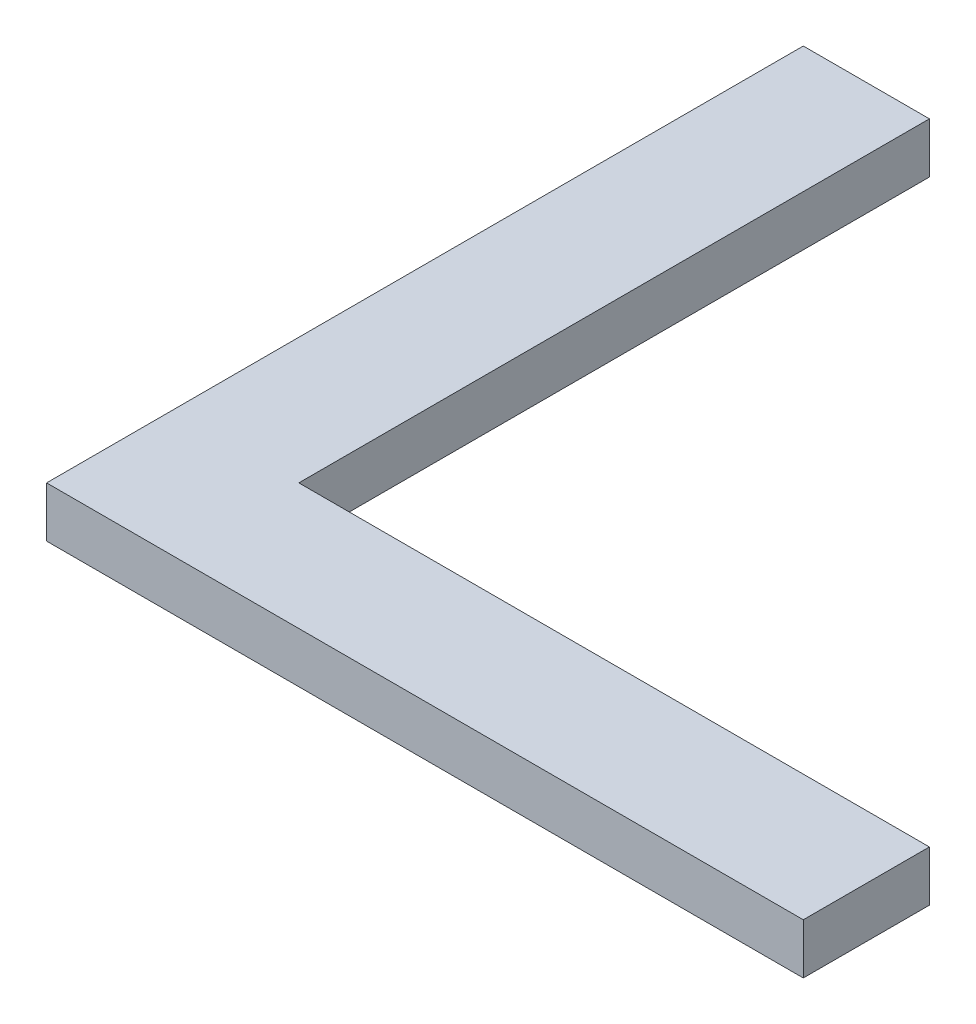
ISO-10303-21;
HEADER;
FILE_DESCRIPTION(('STEP AP214'),'2;1');
FILE_NAME('part.step','',(''),(''),'','','');
FILE_SCHEMA(('AUTOMOTIVE_DESIGN { 1 0 10303 214 1 1 1 1 }'));
ENDSEC;
DATA;
#1=APPLICATION_CONTEXT('core data for automotive mechanical design processes');
#2=APPLICATION_PROTOCOL_DEFINITION('international standard','automotive_design',2000,#1);
#3=PRODUCT_CONTEXT('',#1,'mechanical');
#4=PRODUCT('Part','Part','',(#3));
#5=PRODUCT_RELATED_PRODUCT_CATEGORY('part','',(#4));
#6=PRODUCT_DEFINITION_FORMATION('','',#4);
#7=PRODUCT_DEFINITION_CONTEXT('part definition',#1,'design');
#8=PRODUCT_DEFINITION('design','',#6,#7);
#9=PRODUCT_DEFINITION_SHAPE('','',#8);
#10=(LENGTH_UNIT() NAMED_UNIT(*) SI_UNIT(.MILLI.,.METRE.));
#11=(NAMED_UNIT(*) PLANE_ANGLE_UNIT() SI_UNIT($,.RADIAN.));
#12=(NAMED_UNIT(*) SI_UNIT($,.STERADIAN.) SOLID_ANGLE_UNIT());
#13=UNCERTAINTY_MEASURE_WITH_UNIT(LENGTH_MEASURE(1.E-05),#10,'distance_accuracy_value','');
#14=(GEOMETRIC_REPRESENTATION_CONTEXT(3) GLOBAL_UNCERTAINTY_ASSIGNED_CONTEXT((#13)) GLOBAL_UNIT_ASSIGNED_CONTEXT((#10,
#11,#12)) REPRESENTATION_CONTEXT('',''));
#15=CARTESIAN_POINT('',(0.,0.,0.));
#16=DIRECTION('',(0.,0.,1.));
#17=DIRECTION('',(1.,0.,0.));
#18=AXIS2_PLACEMENT_3D('',#15,#16,#17);
#19=CARTESIAN_POINT('',(31.75,2.54,6.35));
#20=DIRECTION('',(-1.,0.,0.));
#21=DIRECTION('',(0.,0.,1.));
#22=AXIS2_PLACEMENT_3D('',#19,#20,#21);
#23=PLANE('',#22);
#24=DIRECTION('',(0.,0.,-1.));
#25=VECTOR('',#24,1.);
#26=CARTESIAN_POINT('',(31.75,0.,6.35));
#27=LINE('',#26,#25);
#28=CARTESIAN_POINT('',(31.75,0.,6.35));
#29=VERTEX_POINT('',#28);
#30=CARTESIAN_POINT('',(31.75,0.,0.));
#31=VERTEX_POINT('',#30);
#32=EDGE_CURVE('E119',#29,#31,#27,.T.);
#33=ORIENTED_EDGE('',*,*,#32,.T.);
#34=DIRECTION('',(0.,-1.,0.));
#35=VECTOR('',#34,1.);
#36=CARTESIAN_POINT('',(31.75,2.54,0.));
#37=LINE('',#36,#35);
#38=CARTESIAN_POINT('',(31.75,2.54,0.));
#39=VERTEX_POINT('',#38);
#40=EDGE_CURVE('E11',#39,#31,#37,.T.);
#41=ORIENTED_EDGE('',*,*,#40,.F.);
#42=DIRECTION('',(0.,0.,-1.));
#43=VECTOR('',#42,1.);
#44=CARTESIAN_POINT('',(31.75,2.54,6.35));
#45=LINE('',#44,#43);
#46=CARTESIAN_POINT('',(31.75,2.54,6.35));
#47=VERTEX_POINT('',#46);
#48=EDGE_CURVE('E129',#47,#39,#45,.T.);
#49=ORIENTED_EDGE('',*,*,#48,.F.);
#50=DIRECTION('',(0.,-1.,0.));
#51=VECTOR('',#50,1.);
#52=CARTESIAN_POINT('',(31.75,2.54,6.35));
#53=LINE('',#52,#51);
#54=EDGE_CURVE('E115',#47,#29,#53,.T.);
#55=ORIENTED_EDGE('',*,*,#54,.T.);
#56=EDGE_LOOP('',(#33,#41,#49,#55));
#57=FACE_BOUND('',#56,.T.);
#58=ADVANCED_FACE('F35',(#57),#23,.F.);
#59=CARTESIAN_POINT('',(31.75,2.54,0.));
#60=DIRECTION('',(0.,0.,1.));
#61=DIRECTION('',(1.,0.,0.));
#62=AXIS2_PLACEMENT_3D('',#59,#60,#61);
#63=PLANE('',#62);
#64=DIRECTION('',(-1.,0.,0.));
#65=VECTOR('',#64,1.);
#66=CARTESIAN_POINT('',(31.75,0.,0.));
#67=LINE('',#66,#65);
#68=CARTESIAN_POINT('',(0.,0.,0.));
#69=VERTEX_POINT('',#68);
#70=EDGE_CURVE('E122',#31,#69,#67,.T.);
#71=ORIENTED_EDGE('',*,*,#70,.T.);
#72=DIRECTION('',(0.,-1.,0.));
#73=VECTOR('',#72,1.);
#74=CARTESIAN_POINT('',(0.,2.54,0.));
#75=LINE('',#74,#73);
#76=CARTESIAN_POINT('',(0.,2.54,0.));
#77=VERTEX_POINT('',#76);
#78=EDGE_CURVE('E43',#77,#69,#75,.T.);
#79=ORIENTED_EDGE('',*,*,#78,.F.);
#80=DIRECTION('',(-1.,0.,0.));
#81=VECTOR('',#80,1.);
#82=CARTESIAN_POINT('',(31.75,2.54,0.));
#83=LINE('',#82,#81);
#84=EDGE_CURVE('E88',#39,#77,#83,.T.);
#85=ORIENTED_EDGE('',*,*,#84,.F.);
#86=ORIENTED_EDGE('',*,*,#40,.T.);
#87=EDGE_LOOP('',(#71,#79,#85,#86));
#88=FACE_BOUND('',#87,.T.);
#89=ADVANCED_FACE('F153',(#88),#63,.F.);
#90=CARTESIAN_POINT('',(0.,2.54,0.));
#91=DIRECTION('',(-1.,0.,0.));
#92=DIRECTION('',(0.,0.,1.));
#93=AXIS2_PLACEMENT_3D('',#90,#91,#92);
#94=PLANE('',#93);
#95=DIRECTION('',(0.,0.,-1.));
#96=VECTOR('',#95,1.);
#97=CARTESIAN_POINT('',(0.,0.,0.));
#98=LINE('',#97,#96);
#99=CARTESIAN_POINT('',(1.06966278920977E-13,0.,-31.75));
#100=VERTEX_POINT('',#99);
#101=EDGE_CURVE('E124',#69,#100,#98,.T.);
#102=ORIENTED_EDGE('',*,*,#101,.T.);
#103=DIRECTION('',(0.,-1.,0.));
#104=VECTOR('',#103,1.);
#105=CARTESIAN_POINT('',(1.06966278920977E-13,2.54,-31.75));
#106=LINE('',#105,#104);
#107=CARTESIAN_POINT('',(1.06966278920977E-13,2.54,-31.75));
#108=VERTEX_POINT('',#107);
#109=EDGE_CURVE('E110',#108,#100,#106,.T.);
#110=ORIENTED_EDGE('',*,*,#109,.F.);
#111=DIRECTION('',(0.,0.,-1.));
#112=VECTOR('',#111,1.);
#113=CARTESIAN_POINT('',(0.,2.54,0.));
#114=LINE('',#113,#112);
#115=EDGE_CURVE('E101',#77,#108,#114,.T.);
#116=ORIENTED_EDGE('',*,*,#115,.F.);
#117=ORIENTED_EDGE('',*,*,#78,.T.);
#118=EDGE_LOOP('',(#102,#110,#116,#117));
#119=FACE_BOUND('',#118,.T.);
#120=ADVANCED_FACE('F135',(#119),#94,.F.);
#121=CARTESIAN_POINT('',(1.06966278920977E-13,2.54,-31.75));
#122=DIRECTION('',(0.,0.,1.));
#123=DIRECTION('',(1.,0.,0.));
#124=AXIS2_PLACEMENT_3D('',#121,#122,#123);
#125=PLANE('',#124);
#126=DIRECTION('',(-1.,0.,0.));
#127=VECTOR('',#126,1.);
#128=CARTESIAN_POINT('',(1.06966278920977E-13,0.,-31.75));
#129=LINE('',#128,#127);
#130=CARTESIAN_POINT('',(-6.34999999999989,0.,-31.75));
#131=VERTEX_POINT('',#130);
#132=EDGE_CURVE('E109',#100,#131,#129,.T.);
#133=ORIENTED_EDGE('',*,*,#132,.T.);
#134=DIRECTION('',(0.,-1.,0.));
#135=VECTOR('',#134,1.);
#136=CARTESIAN_POINT('',(-6.34999999999989,2.54,-31.75));
#137=LINE('',#136,#135);
#138=CARTESIAN_POINT('',(-6.34999999999989,2.54,-31.75));
#139=VERTEX_POINT('',#138);
#140=EDGE_CURVE('E106',#139,#131,#137,.T.);
#141=ORIENTED_EDGE('',*,*,#140,.F.);
#142=DIRECTION('',(-1.,0.,0.));
#143=VECTOR('',#142,1.);
#144=CARTESIAN_POINT('',(1.06966278920977E-13,2.54,-31.75));
#145=LINE('',#144,#143);
#146=EDGE_CURVE('E95',#108,#139,#145,.T.);
#147=ORIENTED_EDGE('',*,*,#146,.F.);
#148=ORIENTED_EDGE('',*,*,#109,.T.);
#149=EDGE_LOOP('',(#133,#141,#147,#148));
#150=FACE_BOUND('',#149,.T.);
#151=ADVANCED_FACE('F107',(#150),#125,.F.);
#152=CARTESIAN_POINT('',(-6.34999999999989,2.54,-31.75));
#153=DIRECTION('',(1.,0.,0.));
#154=DIRECTION('',(0.,0.,-1.));
#155=AXIS2_PLACEMENT_3D('',#152,#153,#154);
#156=PLANE('',#155);
#157=DIRECTION('',(0.,0.,1.));
#158=VECTOR('',#157,1.);
#159=CARTESIAN_POINT('',(-6.34999999999989,0.,-31.75));
#160=LINE('',#159,#158);
#161=CARTESIAN_POINT('',(-6.35000000000001,0.,6.35));
#162=VERTEX_POINT('',#161);
#163=EDGE_CURVE('E74',#131,#162,#160,.T.);
#164=ORIENTED_EDGE('',*,*,#163,.T.);
#165=DIRECTION('',(0.,-1.,0.));
#166=VECTOR('',#165,1.);
#167=CARTESIAN_POINT('',(-6.35000000000001,2.54,6.35));
#168=LINE('',#167,#166);
#169=CARTESIAN_POINT('',(-6.35000000000001,2.54,6.35));
#170=VERTEX_POINT('',#169);
#171=EDGE_CURVE('E111',#170,#162,#168,.T.);
#172=ORIENTED_EDGE('',*,*,#171,.F.);
#173=DIRECTION('',(0.,0.,1.));
#174=VECTOR('',#173,1.);
#175=CARTESIAN_POINT('',(-6.34999999999989,2.54,-31.75));
#176=LINE('',#175,#174);
#177=EDGE_CURVE('E99',#139,#170,#176,.T.);
#178=ORIENTED_EDGE('',*,*,#177,.F.);
#179=ORIENTED_EDGE('',*,*,#140,.T.);
#180=EDGE_LOOP('',(#164,#172,#178,#179));
#181=FACE_BOUND('',#180,.T.);
#182=ADVANCED_FACE('F113',(#181),#156,.F.);
#183=CARTESIAN_POINT('',(-6.35000000000001,2.54,6.35));
#184=DIRECTION('',(0.,0.,-1.));
#185=DIRECTION('',(-1.,0.,0.));
#186=AXIS2_PLACEMENT_3D('',#183,#184,#185);
#187=PLANE('',#186);
#188=DIRECTION('',(1.,0.,0.));
#189=VECTOR('',#188,1.);
#190=CARTESIAN_POINT('',(-6.35000000000001,0.,6.35));
#191=LINE('',#190,#189);
#192=EDGE_CURVE('E80',#162,#29,#191,.T.);
#193=ORIENTED_EDGE('',*,*,#192,.T.);
#194=ORIENTED_EDGE('',*,*,#54,.F.);
#195=DIRECTION('',(1.,0.,0.));
#196=VECTOR('',#195,1.);
#197=CARTESIAN_POINT('',(-6.35000000000001,2.54,6.35));
#198=LINE('',#197,#196);
#199=EDGE_CURVE('E51',#170,#47,#198,.T.);
#200=ORIENTED_EDGE('',*,*,#199,.F.);
#201=ORIENTED_EDGE('',*,*,#171,.T.);
#202=EDGE_LOOP('',(#193,#194,#200,#201));
#203=FACE_BOUND('',#202,.T.);
#204=ADVANCED_FACE('F142',(#203),#187,.F.);
#205=CARTESIAN_POINT('',(0.,2.54,0.));
#206=DIRECTION('',(0.,1.,0.));
#207=DIRECTION('',(0.,0.,1.));
#208=AXIS2_PLACEMENT_3D('',#205,#206,#207);
#209=PLANE('',#208);
#210=ORIENTED_EDGE('',*,*,#48,.T.);
#211=ORIENTED_EDGE('',*,*,#84,.T.);
#212=ORIENTED_EDGE('',*,*,#115,.T.);
#213=ORIENTED_EDGE('',*,*,#146,.T.);
#214=ORIENTED_EDGE('',*,*,#177,.T.);
#215=ORIENTED_EDGE('',*,*,#199,.T.);
#216=EDGE_LOOP('',(#210,#211,#212,#213,#214,#215));
#217=FACE_BOUND('',#216,.T.);
#218=ADVANCED_FACE('F97',(#217),#209,.T.);
#219=CARTESIAN_POINT('',(0.,0.,0.));
#220=DIRECTION('',(0.,1.,0.));
#221=DIRECTION('',(0.,0.,1.));
#222=AXIS2_PLACEMENT_3D('',#219,#220,#221);
#223=PLANE('',#222);
#224=ORIENTED_EDGE('',*,*,#32,.F.);
#225=ORIENTED_EDGE('',*,*,#192,.F.);
#226=ORIENTED_EDGE('',*,*,#163,.F.);
#227=ORIENTED_EDGE('',*,*,#132,.F.);
#228=ORIENTED_EDGE('',*,*,#101,.F.);
#229=ORIENTED_EDGE('',*,*,#70,.F.);
#230=EDGE_LOOP('',(#224,#225,#226,#227,#228,#229));
#231=FACE_BOUND('',#230,.T.);
#232=ADVANCED_FACE('F138',(#231),#223,.F.);
#233=CLOSED_SHELL('',(#58,#89,#120,#151,#182,#204,#218,#232));
#234=MANIFOLD_SOLID_BREP('B2',#233);
#235=ADVANCED_BREP_SHAPE_REPRESENTATION('',(#18,#234),#14);
#236=SHAPE_DEFINITION_REPRESENTATION(#9,#235);
ENDSEC;
END-ISO-10303-21;
